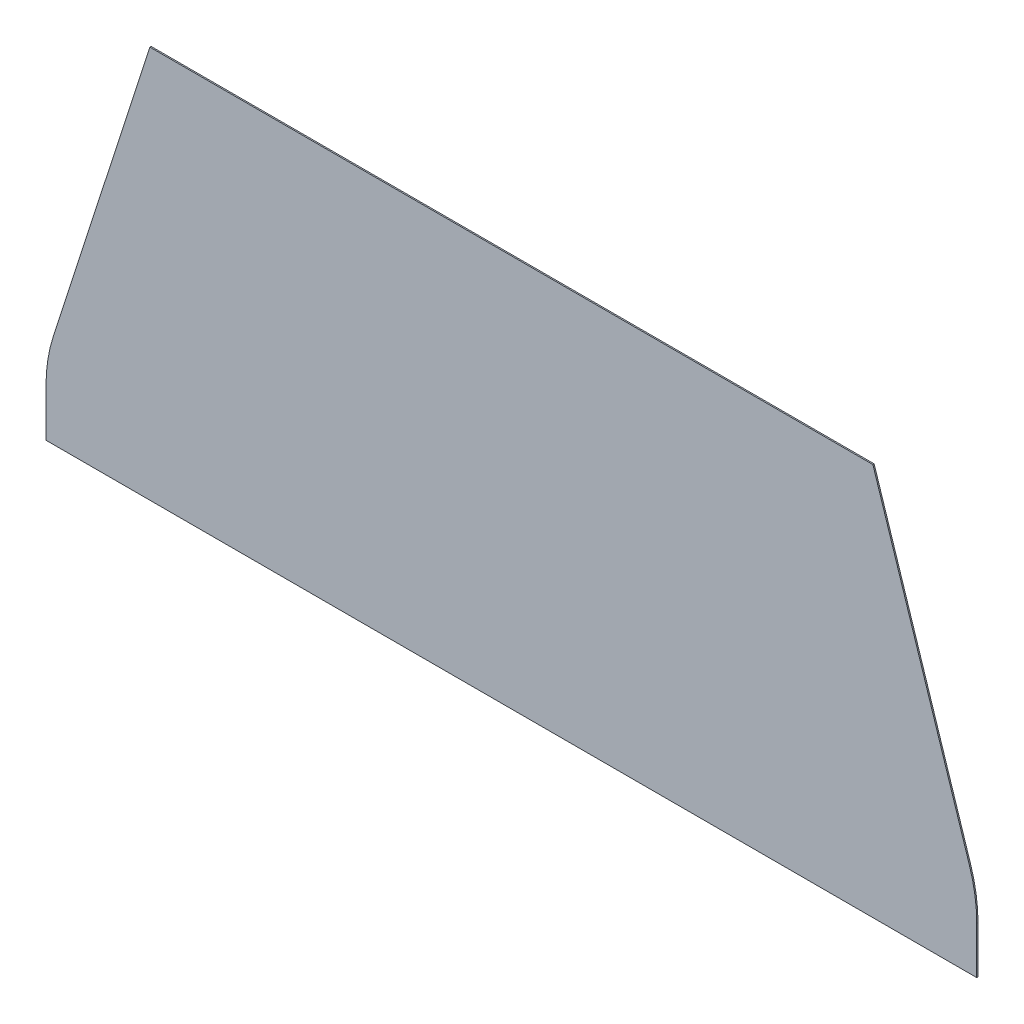
ISO-10303-21;
HEADER;
FILE_DESCRIPTION(('STEP AP214'),'2;1');
FILE_NAME('part.step','',(''),(''),'','','');
FILE_SCHEMA(('AUTOMOTIVE_DESIGN { 1 0 10303 214 1 1 1 1 }'));
ENDSEC;
DATA;
#1=APPLICATION_CONTEXT('core data for automotive mechanical design processes');
#2=APPLICATION_PROTOCOL_DEFINITION('international standard','automotive_design',2000,#1);
#3=PRODUCT_CONTEXT('',#1,'mechanical');
#4=PRODUCT('Part','Part','',(#3));
#5=PRODUCT_RELATED_PRODUCT_CATEGORY('part','',(#4));
#6=PRODUCT_DEFINITION_FORMATION('','',#4);
#7=PRODUCT_DEFINITION_CONTEXT('part definition',#1,'design');
#8=PRODUCT_DEFINITION('design','',#6,#7);
#9=PRODUCT_DEFINITION_SHAPE('','',#8);
#10=(LENGTH_UNIT() NAMED_UNIT(*) SI_UNIT(.MILLI.,.METRE.));
#11=(NAMED_UNIT(*) PLANE_ANGLE_UNIT() SI_UNIT($,.RADIAN.));
#12=(NAMED_UNIT(*) SI_UNIT($,.STERADIAN.) SOLID_ANGLE_UNIT());
#13=UNCERTAINTY_MEASURE_WITH_UNIT(LENGTH_MEASURE(1.E-05),#10,'distance_accuracy_value','');
#14=(GEOMETRIC_REPRESENTATION_CONTEXT(3) GLOBAL_UNCERTAINTY_ASSIGNED_CONTEXT((#13)) GLOBAL_UNIT_ASSIGNED_CONTEXT((#10,
#11,#12)) REPRESENTATION_CONTEXT('',''));
#15=CARTESIAN_POINT('',(0.,0.,0.));
#16=DIRECTION('',(0.,0.,1.));
#17=DIRECTION('',(1.,0.,0.));
#18=AXIS2_PLACEMENT_3D('',#15,#16,#17);
#19=CARTESIAN_POINT('',(-370.,0.,-1.));
#20=DIRECTION('',(0.,-1.,0.));
#21=DIRECTION('',(0.,0.,-1.));
#22=AXIS2_PLACEMENT_3D('',#19,#20,#21);
#23=PLANE('',#22);
#24=DIRECTION('',(1.,0.,0.));
#25=VECTOR('',#24,1.);
#26=CARTESIAN_POINT('',(-370.,0.,0.));
#27=LINE('',#26,#25);
#28=CARTESIAN_POINT('',(-370.,0.,0.));
#29=VERTEX_POINT('',#28);
#30=CARTESIAN_POINT('',(370.,0.,0.));
#31=VERTEX_POINT('',#30);
#32=EDGE_CURVE('E133',#29,#31,#27,.T.);
#33=ORIENTED_EDGE('',*,*,#32,.F.);
#34=DIRECTION('',(0.,0.,1.));
#35=VECTOR('',#34,1.);
#36=CARTESIAN_POINT('',(-370.,0.,-1.));
#37=LINE('',#36,#35);
#38=CARTESIAN_POINT('',(-370.,0.,-1.));
#39=VERTEX_POINT('',#38);
#40=EDGE_CURVE('E11',#39,#29,#37,.T.);
#41=ORIENTED_EDGE('',*,*,#40,.F.);
#42=DIRECTION('',(1.,0.,0.));
#43=VECTOR('',#42,1.);
#44=CARTESIAN_POINT('',(-370.,0.,-1.));
#45=LINE('',#44,#43);
#46=CARTESIAN_POINT('',(370.,0.,-1.));
#47=VERTEX_POINT('',#46);
#48=EDGE_CURVE('E153',#39,#47,#45,.T.);
#49=ORIENTED_EDGE('',*,*,#48,.T.);
#50=DIRECTION('',(0.,0.,1.));
#51=VECTOR('',#50,1.);
#52=CARTESIAN_POINT('',(370.,0.,-1.));
#53=LINE('',#52,#51);
#54=EDGE_CURVE('E39',#47,#31,#53,.T.);
#55=ORIENTED_EDGE('',*,*,#54,.T.);
#56=EDGE_LOOP('',(#33,#41,#49,#55));
#57=FACE_BOUND('',#56,.T.);
#58=ADVANCED_FACE('F36',(#57),#23,.T.);
#59=CARTESIAN_POINT('',(-370.,37.5703532105372,-1.));
#60=DIRECTION('',(-1.,0.,0.));
#61=DIRECTION('',(0.,0.,1.));
#62=AXIS2_PLACEMENT_3D('',#59,#60,#61);
#63=PLANE('',#62);
#64=DIRECTION('',(0.,-1.,0.));
#65=VECTOR('',#64,1.);
#66=CARTESIAN_POINT('',(-370.,37.5703532105372,0.));
#67=LINE('',#66,#65);
#68=CARTESIAN_POINT('',(-370.,37.5703532105372,0.));
#69=VERTEX_POINT('',#68);
#70=EDGE_CURVE('E151',#69,#29,#67,.T.);
#71=ORIENTED_EDGE('',*,*,#70,.F.);
#72=DIRECTION('',(0.,0.,1.));
#73=VECTOR('',#72,1.);
#74=CARTESIAN_POINT('',(-370.,37.5703532105372,-1.));
#75=LINE('',#74,#73);
#76=CARTESIAN_POINT('',(-370.,37.5703532105372,-1.));
#77=VERTEX_POINT('',#76);
#78=EDGE_CURVE('E45',#77,#69,#75,.T.);
#79=ORIENTED_EDGE('',*,*,#78,.F.);
#80=DIRECTION('',(0.,-1.,0.));
#81=VECTOR('',#80,1.);
#82=CARTESIAN_POINT('',(-370.,37.5703532105372,-1.));
#83=LINE('',#82,#81);
#84=EDGE_CURVE('E123',#77,#39,#83,.T.);
#85=ORIENTED_EDGE('',*,*,#84,.T.);
#86=ORIENTED_EDGE('',*,*,#40,.T.);
#87=EDGE_LOOP('',(#71,#79,#85,#86));
#88=FACE_BOUND('',#87,.T.);
#89=ADVANCED_FACE('F165',(#88),#63,.T.);
#90=CARTESIAN_POINT('',(-250.,37.5703532105377,-1.));
#91=DIRECTION('',(0.,0.,1.));
#92=DIRECTION('',(1.,0.,0.));
#93=AXIS2_PLACEMENT_3D('',#90,#91,#92);
#94=CYLINDRICAL_SURFACE('',#93,120.);
#95=CARTESIAN_POINT('',(-250.,37.5703532105377,0.));
#96=DIRECTION('',(0.,0.,1.));
#97=DIRECTION('',(1.,0.,0.));
#98=AXIS2_PLACEMENT_3D('',#95,#96,#97);
#99=CIRCLE('',#98,120.);
#100=CARTESIAN_POINT('',(-364.184889464382,74.4730769312454,0.));
#101=VERTEX_POINT('',#100);
#102=EDGE_CURVE('E110',#101,#69,#99,.T.);
#103=ORIENTED_EDGE('',*,*,#102,.F.);
#104=DIRECTION('',(0.,0.,1.));
#105=VECTOR('',#104,1.);
#106=CARTESIAN_POINT('',(-364.184889464382,74.4730769312454,-1.));
#107=LINE('',#106,#105);
#108=CARTESIAN_POINT('',(-364.184889464382,74.4730769312454,-1.));
#109=VERTEX_POINT('',#108);
#110=EDGE_CURVE('E105',#109,#101,#107,.T.);
#111=ORIENTED_EDGE('',*,*,#110,.F.);
#112=CARTESIAN_POINT('',(-250.,37.5703532105377,-1.));
#113=DIRECTION('',(0.,0.,1.));
#114=DIRECTION('',(1.,0.,0.));
#115=AXIS2_PLACEMENT_3D('',#112,#113,#114);
#116=CIRCLE('',#115,120.);
#117=EDGE_CURVE('E108',#109,#77,#116,.T.);
#118=ORIENTED_EDGE('',*,*,#117,.T.);
#119=ORIENTED_EDGE('',*,*,#78,.T.);
#120=EDGE_LOOP('',(#103,#111,#118,#119));
#121=FACE_BOUND('',#120,.T.);
#122=ADVANCED_FACE('F107',(#121),#94,.T.);
#123=CARTESIAN_POINT('',(-364.184889464382,74.4730769312454,-1.));
#124=DIRECTION('',(-0.951540745536517,0.307522697672561,0.));
#125=DIRECTION('',(-0.307522697672561,-0.951540745536517,0.));
#126=AXIS2_PLACEMENT_3D('',#123,#124,#125);
#127=PLANE('',#126);
#128=DIRECTION('',(-0.307522697672561,-0.951540745536517,0.));
#129=VECTOR('',#128,1.);
#130=CARTESIAN_POINT('',(-364.184889464382,74.4730769312454,0.));
#131=LINE('',#130,#129);
#132=CARTESIAN_POINT('',(-287.42,312.,0.));
#133=VERTEX_POINT('',#132);
#134=EDGE_CURVE('E148',#133,#101,#131,.T.);
#135=ORIENTED_EDGE('',*,*,#134,.F.);
#136=DIRECTION('',(0.,0.,1.));
#137=VECTOR('',#136,1.);
#138=CARTESIAN_POINT('',(-287.42,312.,-1.));
#139=LINE('',#138,#137);
#140=CARTESIAN_POINT('',(-287.42,312.,-1.));
#141=VERTEX_POINT('',#140);
#142=EDGE_CURVE('E115',#141,#133,#139,.T.);
#143=ORIENTED_EDGE('',*,*,#142,.F.);
#144=DIRECTION('',(-0.307522697672561,-0.951540745536517,0.));
#145=VECTOR('',#144,1.);
#146=CARTESIAN_POINT('',(-364.184889464382,74.4730769312454,-1.));
#147=LINE('',#146,#145);
#148=EDGE_CURVE('E121',#141,#109,#147,.T.);
#149=ORIENTED_EDGE('',*,*,#148,.T.);
#150=ORIENTED_EDGE('',*,*,#110,.T.);
#151=EDGE_LOOP('',(#135,#143,#149,#150));
#152=FACE_BOUND('',#151,.T.);
#153=ADVANCED_FACE('F125',(#152),#127,.T.);
#154=CARTESIAN_POINT('',(-287.42,312.,-1.));
#155=DIRECTION('',(0.,1.,0.));
#156=DIRECTION('',(0.,0.,1.));
#157=AXIS2_PLACEMENT_3D('',#154,#155,#156);
#158=PLANE('',#157);
#159=DIRECTION('',(-1.,0.,0.));
#160=VECTOR('',#159,1.);
#161=CARTESIAN_POINT('',(-287.42,312.,0.));
#162=LINE('',#161,#160);
#163=CARTESIAN_POINT('',(287.42,312.,0.));
#164=VERTEX_POINT('',#163);
#165=EDGE_CURVE('E145',#164,#133,#162,.T.);
#166=ORIENTED_EDGE('',*,*,#165,.F.);
#167=DIRECTION('',(0.,0.,1.));
#168=VECTOR('',#167,1.);
#169=CARTESIAN_POINT('',(287.42,312.,-1.));
#170=LINE('',#169,#168);
#171=CARTESIAN_POINT('',(287.42,312.,-1.));
#172=VERTEX_POINT('',#171);
#173=EDGE_CURVE('E157',#172,#164,#170,.T.);
#174=ORIENTED_EDGE('',*,*,#173,.F.);
#175=DIRECTION('',(-1.,0.,0.));
#176=VECTOR('',#175,1.);
#177=CARTESIAN_POINT('',(-287.42,312.,-1.));
#178=LINE('',#177,#176);
#179=EDGE_CURVE('E126',#172,#141,#178,.T.);
#180=ORIENTED_EDGE('',*,*,#179,.T.);
#181=ORIENTED_EDGE('',*,*,#142,.T.);
#182=EDGE_LOOP('',(#166,#174,#180,#181));
#183=FACE_BOUND('',#182,.T.);
#184=ADVANCED_FACE('F178',(#183),#158,.T.);
#185=CARTESIAN_POINT('',(287.42,312.,-1.));
#186=DIRECTION('',(0.951540745536517,0.307522697672561,0.));
#187=DIRECTION('',(-0.307522697672561,0.951540745536517,0.));
#188=AXIS2_PLACEMENT_3D('',#185,#186,#187);
#189=PLANE('',#188);
#190=DIRECTION('',(-0.307522697672561,0.951540745536517,0.));
#191=VECTOR('',#190,1.);
#192=CARTESIAN_POINT('',(287.42,312.,0.));
#193=LINE('',#192,#191);
#194=CARTESIAN_POINT('',(364.184889464382,74.4730769312449,0.));
#195=VERTEX_POINT('',#194);
#196=EDGE_CURVE('E142',#195,#164,#193,.T.);
#197=ORIENTED_EDGE('',*,*,#196,.F.);
#198=DIRECTION('',(0.,0.,1.));
#199=VECTOR('',#198,1.);
#200=CARTESIAN_POINT('',(364.184889464382,74.4730769312449,-1.));
#201=LINE('',#200,#199);
#202=CARTESIAN_POINT('',(364.184889464382,74.4730769312449,-1.));
#203=VERTEX_POINT('',#202);
#204=EDGE_CURVE('E159',#203,#195,#201,.T.);
#205=ORIENTED_EDGE('',*,*,#204,.F.);
#206=DIRECTION('',(-0.307522697672561,0.951540745536517,0.));
#207=VECTOR('',#206,1.);
#208=CARTESIAN_POINT('',(287.42,312.,-1.));
#209=LINE('',#208,#207);
#210=EDGE_CURVE('E128',#203,#172,#209,.T.);
#211=ORIENTED_EDGE('',*,*,#210,.T.);
#212=ORIENTED_EDGE('',*,*,#173,.T.);
#213=EDGE_LOOP('',(#197,#205,#211,#212));
#214=FACE_BOUND('',#213,.T.);
#215=ADVANCED_FACE('F181',(#214),#189,.T.);
#216=CARTESIAN_POINT('',(250.,37.5703532105376,-1.));
#217=DIRECTION('',(0.,0.,1.));
#218=DIRECTION('',(1.,0.,0.));
#219=AXIS2_PLACEMENT_3D('',#216,#217,#218);
#220=CYLINDRICAL_SURFACE('',#219,120.);
#221=CARTESIAN_POINT('',(250.,37.5703532105376,0.));
#222=DIRECTION('',(0.,0.,1.));
#223=DIRECTION('',(1.,0.,0.));
#224=AXIS2_PLACEMENT_3D('',#221,#222,#223);
#225=CIRCLE('',#224,120.);
#226=CARTESIAN_POINT('',(370.,37.5703532105376,0.));
#227=VERTEX_POINT('',#226);
#228=EDGE_CURVE('E139',#227,#195,#225,.T.);
#229=ORIENTED_EDGE('',*,*,#228,.F.);
#230=DIRECTION('',(0.,0.,1.));
#231=VECTOR('',#230,1.);
#232=CARTESIAN_POINT('',(370.,37.5703532105376,-1.));
#233=LINE('',#232,#231);
#234=CARTESIAN_POINT('',(370.,37.5703532105376,-1.));
#235=VERTEX_POINT('',#234);
#236=EDGE_CURVE('E160',#235,#227,#233,.T.);
#237=ORIENTED_EDGE('',*,*,#236,.F.);
#238=CARTESIAN_POINT('',(250.,37.5703532105376,-1.));
#239=DIRECTION('',(0.,0.,1.));
#240=DIRECTION('',(1.,0.,0.));
#241=AXIS2_PLACEMENT_3D('',#238,#239,#240);
#242=CIRCLE('',#241,120.);
#243=EDGE_CURVE('E276',#235,#203,#242,.T.);
#244=ORIENTED_EDGE('',*,*,#243,.T.);
#245=ORIENTED_EDGE('',*,*,#204,.T.);
#246=EDGE_LOOP('',(#229,#237,#244,#245));
#247=FACE_BOUND('',#246,.T.);
#248=ADVANCED_FACE('F185',(#247),#220,.T.);
#249=CARTESIAN_POINT('',(370.,0.,-1.));
#250=DIRECTION('',(1.,0.,0.));
#251=DIRECTION('',(0.,0.,-1.));
#252=AXIS2_PLACEMENT_3D('',#249,#250,#251);
#253=PLANE('',#252);
#254=DIRECTION('',(0.,1.,0.));
#255=VECTOR('',#254,1.);
#256=CARTESIAN_POINT('',(370.,0.,0.));
#257=LINE('',#256,#255);
#258=EDGE_CURVE('E136',#31,#227,#257,.T.);
#259=ORIENTED_EDGE('',*,*,#258,.F.);
#260=ORIENTED_EDGE('',*,*,#54,.F.);
#261=DIRECTION('',(0.,1.,0.));
#262=VECTOR('',#261,1.);
#263=CARTESIAN_POINT('',(370.,0.,-1.));
#264=LINE('',#263,#262);
#265=EDGE_CURVE('E277',#47,#235,#264,.T.);
#266=ORIENTED_EDGE('',*,*,#265,.T.);
#267=ORIENTED_EDGE('',*,*,#236,.T.);
#268=EDGE_LOOP('',(#259,#260,#266,#267));
#269=FACE_BOUND('',#268,.T.);
#270=ADVANCED_FACE('F162',(#269),#253,.T.);
#271=CARTESIAN_POINT('',(250.,37.5703532105376,-1.));
#272=DIRECTION('',(0.,0.,1.));
#273=DIRECTION('',(1.,0.,0.));
#274=AXIS2_PLACEMENT_3D('',#271,#272,#273);
#275=PLANE('',#274);
#276=ORIENTED_EDGE('',*,*,#48,.F.);
#277=ORIENTED_EDGE('',*,*,#84,.F.);
#278=ORIENTED_EDGE('',*,*,#117,.F.);
#279=ORIENTED_EDGE('',*,*,#148,.F.);
#280=ORIENTED_EDGE('',*,*,#179,.F.);
#281=ORIENTED_EDGE('',*,*,#210,.F.);
#282=ORIENTED_EDGE('',*,*,#243,.F.);
#283=ORIENTED_EDGE('',*,*,#265,.F.);
#284=EDGE_LOOP('',(#276,#277,#278,#279,#280,#281,#282,#283));
#285=FACE_BOUND('',#284,.T.);
#286=ADVANCED_FACE('F119',(#285),#275,.F.);
#287=CARTESIAN_POINT('',(250.,37.5703532105376,0.));
#288=DIRECTION('',(0.,0.,1.));
#289=DIRECTION('',(1.,0.,0.));
#290=AXIS2_PLACEMENT_3D('',#287,#288,#289);
#291=PLANE('',#290);
#292=ORIENTED_EDGE('',*,*,#32,.T.);
#293=ORIENTED_EDGE('',*,*,#258,.T.);
#294=ORIENTED_EDGE('',*,*,#228,.T.);
#295=ORIENTED_EDGE('',*,*,#196,.T.);
#296=ORIENTED_EDGE('',*,*,#165,.T.);
#297=ORIENTED_EDGE('',*,*,#134,.T.);
#298=ORIENTED_EDGE('',*,*,#102,.T.);
#299=ORIENTED_EDGE('',*,*,#70,.T.);
#300=EDGE_LOOP('',(#292,#293,#294,#295,#296,#297,#298,#299));
#301=FACE_BOUND('',#300,.T.);
#302=ADVANCED_FACE('F164',(#301),#291,.T.);
#303=CLOSED_SHELL('',(#58,#89,#122,#153,#184,#215,#248,#270,#286,#302));
#304=MANIFOLD_SOLID_BREP('B2',#303);
#305=ADVANCED_BREP_SHAPE_REPRESENTATION('',(#18,#304),#14);
#306=SHAPE_DEFINITION_REPRESENTATION(#9,#305);
ENDSEC;
END-ISO-10303-21;
